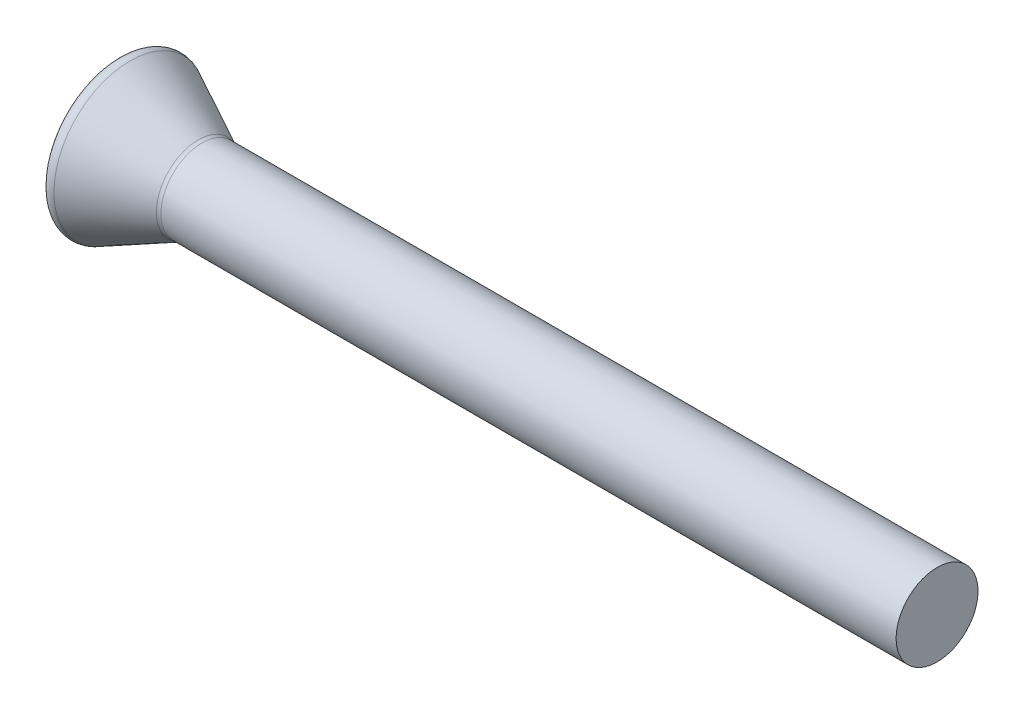
ISO-10303-21;
HEADER;
FILE_DESCRIPTION(('STEP AP214'),'2;1');
FILE_NAME('part.step','',(''),(''),'','','');
FILE_SCHEMA(('AUTOMOTIVE_DESIGN { 1 0 10303 214 1 1 1 1 }'));
ENDSEC;
DATA;
#1=APPLICATION_CONTEXT('core data for automotive mechanical design processes');
#2=APPLICATION_PROTOCOL_DEFINITION('international standard','automotive_design',2000,#1);
#3=PRODUCT_CONTEXT('',#1,'mechanical');
#4=PRODUCT('Part','Part','',(#3));
#5=PRODUCT_RELATED_PRODUCT_CATEGORY('part','',(#4));
#6=PRODUCT_DEFINITION_FORMATION('','',#4);
#7=PRODUCT_DEFINITION_CONTEXT('part definition',#1,'design');
#8=PRODUCT_DEFINITION('design','',#6,#7);
#9=PRODUCT_DEFINITION_SHAPE('','',#8);
#10=(LENGTH_UNIT() NAMED_UNIT(*) SI_UNIT(.MILLI.,.METRE.));
#11=(NAMED_UNIT(*) PLANE_ANGLE_UNIT() SI_UNIT($,.RADIAN.));
#12=(NAMED_UNIT(*) SI_UNIT($,.STERADIAN.) SOLID_ANGLE_UNIT());
#13=UNCERTAINTY_MEASURE_WITH_UNIT(LENGTH_MEASURE(1.E-05),#10,'distance_accuracy_value','');
#14=(GEOMETRIC_REPRESENTATION_CONTEXT(3) GLOBAL_UNCERTAINTY_ASSIGNED_CONTEXT((#13)) GLOBAL_UNIT_ASSIGNED_CONTEXT((#10,
#11,#12)) REPRESENTATION_CONTEXT('',''));
#15=CARTESIAN_POINT('',(0.,0.,0.));
#16=DIRECTION('',(0.,0.,1.));
#17=DIRECTION('',(1.,0.,0.));
#18=AXIS2_PLACEMENT_3D('',#15,#16,#17);
#19=CARTESIAN_POINT('',(10.,0.5,0.));
#20=DIRECTION('',(-1.,0.,0.));
#21=DIRECTION('',(0.,-1.,0.));
#22=AXIS2_PLACEMENT_3D('',#19,#20,#21);
#23=PLANE('',#22);
#24=CARTESIAN_POINT('',(10.,0.,0.));
#25=DIRECTION('',(1.,0.,0.));
#26=DIRECTION('',(0.,1.,0.));
#27=AXIS2_PLACEMENT_3D('',#24,#25,#26);
#28=CIRCLE('',#27,0.5);
#29=CARTESIAN_POINT('',(10.,0.5,0.));
#30=VERTEX_POINT('',#29);
#31=EDGE_CURVE('E65',#30,#30,#28,.T.);
#32=ORIENTED_EDGE('',*,*,#31,.T.);
#33=EDGE_LOOP('',(#32));
#34=FACE_BOUND('',#33,.T.);
#35=ADVANCED_FACE('F41',(#34),#23,.F.);
#36=CARTESIAN_POINT('',(0.,0.,0.));
#37=DIRECTION('',(1.,0.,0.));
#38=DIRECTION('',(0.,1.,0.));
#39=AXIS2_PLACEMENT_3D('',#36,#37,#38);
#40=PLANE('',#39);
#41=CARTESIAN_POINT('',(0.,0.,0.));
#42=DIRECTION('',(1.,0.,0.));
#43=DIRECTION('',(0.,1.,0.));
#44=AXIS2_PLACEMENT_3D('',#41,#42,#43);
#45=CIRCLE('',#44,0.83819660112501);
#46=CARTESIAN_POINT('',(0.,0.83819660112501,0.));
#47=VERTEX_POINT('',#46);
#48=EDGE_CURVE('E49',#47,#47,#45,.F.);
#49=ORIENTED_EDGE('',*,*,#48,.T.);
#50=EDGE_LOOP('',(#49));
#51=FACE_BOUND('',#50,.T.);
#52=ADVANCED_FACE('F81',(#51),#40,.F.);
#53=CARTESIAN_POINT('',(0.,0.,0.));
#54=DIRECTION('',(-1.,0.,0.));
#55=DIRECTION('',(0.,-1.,0.));
#56=AXIS2_PLACEMENT_3D('',#53,#54,#55);
#57=CONICAL_SURFACE('',#56,1.,0.463647609000807);
#58=CARTESIAN_POINT('',(0.144721359549996,0.,0.));
#59=DIRECTION('',(1.,0.,0.));
#60=DIRECTION('',(0.,1.,0.));
#61=AXIS2_PLACEMENT_3D('',#58,#59,#60);
#62=CIRCLE('',#61,0.927639320225002);
#63=CARTESIAN_POINT('',(0.144721359549996,0.927639320225002,0.));
#64=VERTEX_POINT('',#63);
#65=EDGE_CURVE('E54',#64,#64,#62,.T.);
#66=ORIENTED_EDGE('',*,*,#65,.T.);
#67=EDGE_LOOP('',(#66));
#68=FACE_BOUND('',#67,.T.);
#69=CARTESIAN_POINT('',(0.978885438199982,0.,0.));
#70=DIRECTION('',(-1.,0.,0.));
#71=DIRECTION('',(0.,-1.,0.));
#72=AXIS2_PLACEMENT_3D('',#69,#70,#71);
#73=CIRCLE('',#72,0.510557280900008);
#74=CARTESIAN_POINT('',(0.978885438199982,-0.510557280900008,0.));
#75=VERTEX_POINT('',#74);
#76=EDGE_CURVE('E59',#75,#75,#73,.T.);
#77=ORIENTED_EDGE('',*,*,#76,.T.);
#78=EDGE_LOOP('',(#77));
#79=FACE_BOUND('',#78,.T.);
#80=ADVANCED_FACE('F74',(#68,#79),#57,.T.);
#81=CARTESIAN_POINT('',(10.,0.,0.));
#82=DIRECTION('',(1.,0.,0.));
#83=DIRECTION('',(0.,1.,0.));
#84=AXIS2_PLACEMENT_3D('',#81,#82,#83);
#85=CYLINDRICAL_SURFACE('',#84,0.5);
#86=CARTESIAN_POINT('',(1.02360679774998,0.,0.));
#87=DIRECTION('',(1.,0.,0.));
#88=DIRECTION('',(0.,1.,0.));
#89=AXIS2_PLACEMENT_3D('',#86,#87,#88);
#90=CIRCLE('',#89,0.5);
#91=CARTESIAN_POINT('',(1.02360679774998,0.5,0.));
#92=VERTEX_POINT('',#91);
#93=EDGE_CURVE('E10',#92,#92,#90,.T.);
#94=ORIENTED_EDGE('',*,*,#93,.T.);
#95=EDGE_LOOP('',(#94));
#96=FACE_BOUND('',#95,.T.);
#97=ORIENTED_EDGE('',*,*,#31,.F.);
#98=EDGE_LOOP('',(#97));
#99=FACE_BOUND('',#98,.T.);
#100=ADVANCED_FACE('F71',(#96,#99),#85,.T.);
#101=CARTESIAN_POINT('',(0.1,0.,0.));
#102=DIRECTION('',(1.,0.,0.));
#103=DIRECTION('',(0.,1.,0.));
#104=AXIS2_PLACEMENT_3D('',#101,#102,#103);
#105=TOROIDAL_SURFACE('',#104,0.83819660112501,0.1);
#106=ORIENTED_EDGE('',*,*,#48,.F.);
#107=EDGE_LOOP('',(#106));
#108=FACE_BOUND('',#107,.T.);
#109=ORIENTED_EDGE('',*,*,#65,.F.);
#110=EDGE_LOOP('',(#109));
#111=FACE_BOUND('',#110,.T.);
#112=ADVANCED_FACE('F73',(#108,#111),#105,.T.);
#113=CARTESIAN_POINT('',(1.02360679774998,0.,0.));
#114=DIRECTION('',(1.,0.,0.));
#115=DIRECTION('',(0.,1.,0.));
#116=AXIS2_PLACEMENT_3D('',#113,#114,#115);
#117=TOROIDAL_SURFACE('',#116,0.6,0.1);
#118=ORIENTED_EDGE('',*,*,#76,.F.);
#119=EDGE_LOOP('',(#118));
#120=FACE_BOUND('',#119,.T.);
#121=ORIENTED_EDGE('',*,*,#93,.F.);
#122=EDGE_LOOP('',(#121));
#123=FACE_BOUND('',#122,.T.);
#124=ADVANCED_FACE('F43',(#120,#123),#117,.F.);
#125=CLOSED_SHELL('',(#35,#52,#80,#100,#112,#124));
#126=MANIFOLD_SOLID_BREP('B2',#125);
#127=ADVANCED_BREP_SHAPE_REPRESENTATION('',(#18,#126),#14);
#128=SHAPE_DEFINITION_REPRESENTATION(#9,#127);
ENDSEC;
END-ISO-10303-21;
